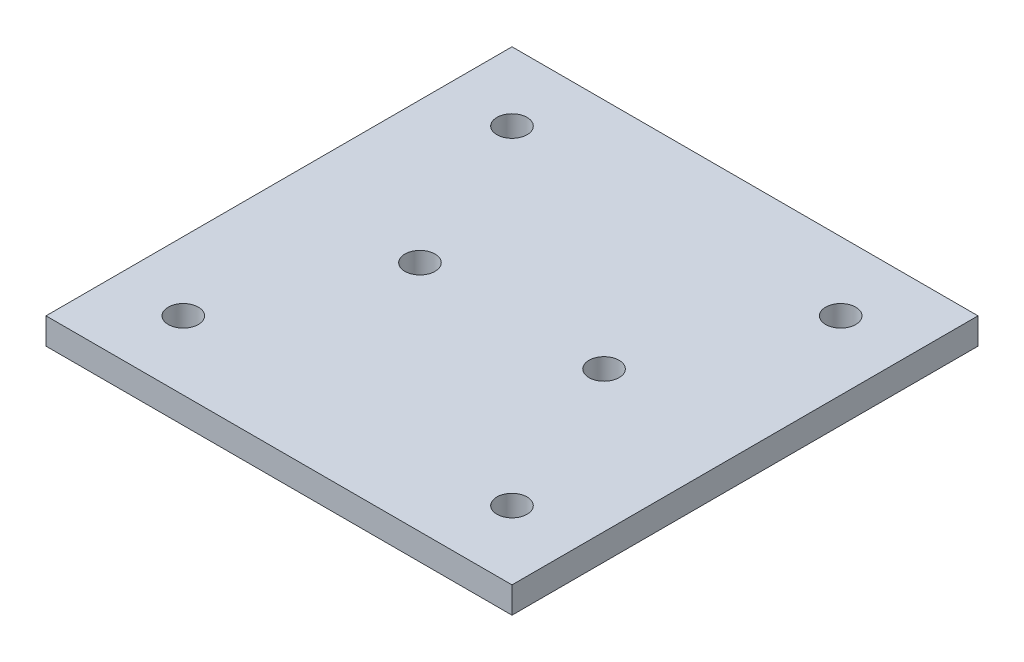
ISO-10303-21;
HEADER;
FILE_DESCRIPTION(('STEP AP214'),'2;1');
FILE_NAME('part.step','',(''),(''),'','','');
FILE_SCHEMA(('AUTOMOTIVE_DESIGN { 1 0 10303 214 1 1 1 1 }'));
ENDSEC;
DATA;
#1=APPLICATION_CONTEXT('core data for automotive mechanical design processes');
#2=APPLICATION_PROTOCOL_DEFINITION('international standard','automotive_design',2000,#1);
#3=PRODUCT_CONTEXT('',#1,'mechanical');
#4=PRODUCT('Part','Part','',(#3));
#5=PRODUCT_RELATED_PRODUCT_CATEGORY('part','',(#4));
#6=PRODUCT_DEFINITION_FORMATION('','',#4);
#7=PRODUCT_DEFINITION_CONTEXT('part definition',#1,'design');
#8=PRODUCT_DEFINITION('design','',#6,#7);
#9=PRODUCT_DEFINITION_SHAPE('','',#8);
#10=(LENGTH_UNIT() NAMED_UNIT(*) SI_UNIT(.MILLI.,.METRE.));
#11=(NAMED_UNIT(*) PLANE_ANGLE_UNIT() SI_UNIT($,.RADIAN.));
#12=(NAMED_UNIT(*) SI_UNIT($,.STERADIAN.) SOLID_ANGLE_UNIT());
#13=UNCERTAINTY_MEASURE_WITH_UNIT(LENGTH_MEASURE(1.E-05),#10,'distance_accuracy_value','');
#14=(GEOMETRIC_REPRESENTATION_CONTEXT(3) GLOBAL_UNCERTAINTY_ASSIGNED_CONTEXT((#13)) GLOBAL_UNIT_ASSIGNED_CONTEXT((#10,
#11,#12)) REPRESENTATION_CONTEXT('',''));
#15=CARTESIAN_POINT('',(0.,0.,0.));
#16=DIRECTION('',(0.,0.,1.));
#17=DIRECTION('',(1.,0.,0.));
#18=AXIS2_PLACEMENT_3D('',#15,#16,#17);
#19=CARTESIAN_POINT('',(0.,2.,0.));
#20=DIRECTION('',(0.,1.,0.));
#21=DIRECTION('',(0.,0.,1.));
#22=AXIS2_PLACEMENT_3D('',#19,#20,#21);
#23=PLANE('',#22);
#24=CARTESIAN_POINT('',(-7.,2.,0.));
#25=DIRECTION('',(0.,1.,0.));
#26=DIRECTION('',(0.,0.,1.));
#27=AXIS2_PLACEMENT_3D('',#24,#25,#26);
#28=CIRCLE('',#27,1.1462255868277);
#29=CARTESIAN_POINT('',(-7.,2.,1.1462255868277));
#30=VERTEX_POINT('',#29);
#31=EDGE_CURVE('E133',#30,#30,#28,.T.);
#32=ORIENTED_EDGE('',*,*,#31,.F.);
#33=EDGE_LOOP('',(#32));
#34=FACE_BOUND('',#33,.T.);
#35=CARTESIAN_POINT('',(12.5,2.,12.5));
#36=DIRECTION('',(0.,1.,0.));
#37=DIRECTION('',(0.,0.,1.));
#38=AXIS2_PLACEMENT_3D('',#35,#36,#37);
#39=CIRCLE('',#38,1.1462255868277);
#40=CARTESIAN_POINT('',(12.5,2.,13.6462255868277));
#41=VERTEX_POINT('',#40);
#42=EDGE_CURVE('E121',#41,#41,#39,.T.);
#43=ORIENTED_EDGE('',*,*,#42,.F.);
#44=EDGE_LOOP('',(#43));
#45=FACE_BOUND('',#44,.T.);
#46=CARTESIAN_POINT('',(-12.5,2.,-12.5));
#47=DIRECTION('',(0.,1.,0.));
#48=DIRECTION('',(0.,0.,1.));
#49=AXIS2_PLACEMENT_3D('',#46,#47,#48);
#50=CIRCLE('',#49,1.1462255868277);
#51=CARTESIAN_POINT('',(-12.5,2.,-11.3537744131723));
#52=VERTEX_POINT('',#51);
#53=EDGE_CURVE('E100',#52,#52,#50,.T.);
#54=ORIENTED_EDGE('',*,*,#53,.F.);
#55=EDGE_LOOP('',(#54));
#56=FACE_BOUND('',#55,.T.);
#57=DIRECTION('',(0.,0.,1.));
#58=VECTOR('',#57,1.);
#59=CARTESIAN_POINT('',(-17.7215425612055,2.,17.7215425612055));
#60=LINE('',#59,#58);
#61=CARTESIAN_POINT('',(-17.7215425612055,2.,-17.7215425612055));
#62=VERTEX_POINT('',#61);
#63=CARTESIAN_POINT('',(-17.7215425612055,2.,17.7215425612055));
#64=VERTEX_POINT('',#63);
#65=EDGE_CURVE('E85',#62,#64,#60,.T.);
#66=ORIENTED_EDGE('',*,*,#65,.T.);
#67=DIRECTION('',(1.,0.,0.));
#68=VECTOR('',#67,1.);
#69=CARTESIAN_POINT('',(17.7215425612055,2.,17.7215425612055));
#70=LINE('',#69,#68);
#71=CARTESIAN_POINT('',(17.7215425612055,2.,17.7215425612055));
#72=VERTEX_POINT('',#71);
#73=EDGE_CURVE('E80',#64,#72,#70,.T.);
#74=ORIENTED_EDGE('',*,*,#73,.T.);
#75=DIRECTION('',(0.,0.,-1.));
#76=VECTOR('',#75,1.);
#77=CARTESIAN_POINT('',(17.7215425612055,2.,17.7215425612055));
#78=LINE('',#77,#76);
#79=CARTESIAN_POINT('',(17.7215425612055,2.,-17.7215425612055));
#80=VERTEX_POINT('',#79);
#81=EDGE_CURVE('E83',#72,#80,#78,.T.);
#82=ORIENTED_EDGE('',*,*,#81,.T.);
#83=DIRECTION('',(-1.,0.,0.));
#84=VECTOR('',#83,1.);
#85=CARTESIAN_POINT('',(17.7215425612055,2.,-17.7215425612055));
#86=LINE('',#85,#84);
#87=EDGE_CURVE('E50',#80,#62,#86,.T.);
#88=ORIENTED_EDGE('',*,*,#87,.T.);
#89=EDGE_LOOP('',(#66,#74,#82,#88));
#90=FACE_BOUND('',#89,.T.);
#91=CARTESIAN_POINT('',(12.5,2.,-12.5));
#92=DIRECTION('',(0.,1.,0.));
#93=DIRECTION('',(0.,0.,-1.));
#94=AXIS2_PLACEMENT_3D('',#91,#92,#93);
#95=CIRCLE('',#94,1.1462255868277);
#96=CARTESIAN_POINT('',(12.5,2.,-13.6462255868277));
#97=VERTEX_POINT('',#96);
#98=EDGE_CURVE('E115',#97,#97,#95,.T.);
#99=ORIENTED_EDGE('',*,*,#98,.F.);
#100=EDGE_LOOP('',(#99));
#101=FACE_BOUND('',#100,.T.);
#102=CARTESIAN_POINT('',(-12.5,2.,12.5));
#103=DIRECTION('',(0.,1.,0.));
#104=DIRECTION('',(0.,0.,-1.));
#105=AXIS2_PLACEMENT_3D('',#102,#103,#104);
#106=CIRCLE('',#105,1.1462255868277);
#107=CARTESIAN_POINT('',(-12.5,2.,11.3537744131723));
#108=VERTEX_POINT('',#107);
#109=EDGE_CURVE('E127',#108,#108,#106,.T.);
#110=ORIENTED_EDGE('',*,*,#109,.F.);
#111=EDGE_LOOP('',(#110));
#112=FACE_BOUND('',#111,.T.);
#113=CARTESIAN_POINT('',(7.,2.,0.));
#114=DIRECTION('',(0.,1.,0.));
#115=DIRECTION('',(0.,0.,-1.));
#116=AXIS2_PLACEMENT_3D('',#113,#114,#115);
#117=CIRCLE('',#116,1.1462255868277);
#118=CARTESIAN_POINT('',(7.,2.,-1.14622558682769));
#119=VERTEX_POINT('',#118);
#120=EDGE_CURVE('E139',#119,#119,#117,.T.);
#121=ORIENTED_EDGE('',*,*,#120,.F.);
#122=EDGE_LOOP('',(#121));
#123=FACE_BOUND('',#122,.T.);
#124=ADVANCED_FACE('F33',(#34,#45,#56,#90,#101,#112,#123),#23,.T.);
#125=CARTESIAN_POINT('',(0.,0.,0.));
#126=DIRECTION('',(0.,1.,0.));
#127=DIRECTION('',(0.,0.,1.));
#128=AXIS2_PLACEMENT_3D('',#125,#126,#127);
#129=PLANE('',#128);
#130=CARTESIAN_POINT('',(-7.,0.,0.));
#131=DIRECTION('',(0.,1.,0.));
#132=DIRECTION('',(0.,0.,1.));
#133=AXIS2_PLACEMENT_3D('',#130,#131,#132);
#134=CIRCLE('',#133,1.1462255868277);
#135=CARTESIAN_POINT('',(-7.,0.,1.1462255868277));
#136=VERTEX_POINT('',#135);
#137=EDGE_CURVE('E136',#136,#136,#134,.T.);
#138=ORIENTED_EDGE('',*,*,#137,.T.);
#139=EDGE_LOOP('',(#138));
#140=FACE_BOUND('',#139,.T.);
#141=CARTESIAN_POINT('',(12.5,0.,12.5));
#142=DIRECTION('',(0.,1.,0.));
#143=DIRECTION('',(0.,0.,1.));
#144=AXIS2_PLACEMENT_3D('',#141,#142,#143);
#145=CIRCLE('',#144,1.1462255868277);
#146=CARTESIAN_POINT('',(12.5,0.,13.6462255868277));
#147=VERTEX_POINT('',#146);
#148=EDGE_CURVE('E124',#147,#147,#145,.T.);
#149=ORIENTED_EDGE('',*,*,#148,.T.);
#150=EDGE_LOOP('',(#149));
#151=FACE_BOUND('',#150,.T.);
#152=CARTESIAN_POINT('',(-12.5,0.,-12.5));
#153=DIRECTION('',(0.,1.,0.));
#154=DIRECTION('',(0.,0.,1.));
#155=AXIS2_PLACEMENT_3D('',#152,#153,#154);
#156=CIRCLE('',#155,1.1462255868277);
#157=CARTESIAN_POINT('',(-12.5,0.,-11.3537744131723));
#158=VERTEX_POINT('',#157);
#159=EDGE_CURVE('E112',#158,#158,#156,.T.);
#160=ORIENTED_EDGE('',*,*,#159,.T.);
#161=EDGE_LOOP('',(#160));
#162=FACE_BOUND('',#161,.T.);
#163=DIRECTION('',(0.,0.,1.));
#164=VECTOR('',#163,1.);
#165=CARTESIAN_POINT('',(-17.7215425612055,0.,17.7215425612055));
#166=LINE('',#165,#164);
#167=CARTESIAN_POINT('',(-17.7215425612055,0.,-17.7215425612055));
#168=VERTEX_POINT('',#167);
#169=CARTESIAN_POINT('',(-17.7215425612055,0.,17.7215425612055));
#170=VERTEX_POINT('',#169);
#171=EDGE_CURVE('E97',#168,#170,#166,.T.);
#172=ORIENTED_EDGE('',*,*,#171,.F.);
#173=DIRECTION('',(-1.,0.,0.));
#174=VECTOR('',#173,1.);
#175=CARTESIAN_POINT('',(17.7215425612055,0.,-17.7215425612055));
#176=LINE('',#175,#174);
#177=CARTESIAN_POINT('',(17.7215425612055,0.,-17.7215425612055));
#178=VERTEX_POINT('',#177);
#179=EDGE_CURVE('E73',#178,#168,#176,.T.);
#180=ORIENTED_EDGE('',*,*,#179,.F.);
#181=DIRECTION('',(0.,0.,-1.));
#182=VECTOR('',#181,1.);
#183=CARTESIAN_POINT('',(17.7215425612055,0.,17.7215425612055));
#184=LINE('',#183,#182);
#185=CARTESIAN_POINT('',(17.7215425612055,0.,17.7215425612055));
#186=VERTEX_POINT('',#185);
#187=EDGE_CURVE('E67',#186,#178,#184,.T.);
#188=ORIENTED_EDGE('',*,*,#187,.F.);
#189=DIRECTION('',(1.,0.,0.));
#190=VECTOR('',#189,1.);
#191=CARTESIAN_POINT('',(17.7215425612055,0.,17.7215425612055));
#192=LINE('',#191,#190);
#193=EDGE_CURVE('E89',#170,#186,#192,.T.);
#194=ORIENTED_EDGE('',*,*,#193,.F.);
#195=EDGE_LOOP('',(#172,#180,#188,#194));
#196=FACE_BOUND('',#195,.T.);
#197=CARTESIAN_POINT('',(12.5,0.,-12.5));
#198=DIRECTION('',(0.,1.,0.));
#199=DIRECTION('',(0.,0.,-1.));
#200=AXIS2_PLACEMENT_3D('',#197,#198,#199);
#201=CIRCLE('',#200,1.1462255868277);
#202=CARTESIAN_POINT('',(12.5,0.,-13.6462255868277));
#203=VERTEX_POINT('',#202);
#204=EDGE_CURVE('E118',#203,#203,#201,.T.);
#205=ORIENTED_EDGE('',*,*,#204,.T.);
#206=EDGE_LOOP('',(#205));
#207=FACE_BOUND('',#206,.T.);
#208=CARTESIAN_POINT('',(-12.5,0.,12.5));
#209=DIRECTION('',(0.,1.,0.));
#210=DIRECTION('',(0.,0.,-1.));
#211=AXIS2_PLACEMENT_3D('',#208,#209,#210);
#212=CIRCLE('',#211,1.1462255868277);
#213=CARTESIAN_POINT('',(-12.5,0.,11.3537744131723));
#214=VERTEX_POINT('',#213);
#215=EDGE_CURVE('E130',#214,#214,#212,.T.);
#216=ORIENTED_EDGE('',*,*,#215,.T.);
#217=EDGE_LOOP('',(#216));
#218=FACE_BOUND('',#217,.T.);
#219=CARTESIAN_POINT('',(7.,0.,0.));
#220=DIRECTION('',(0.,1.,0.));
#221=DIRECTION('',(0.,0.,-1.));
#222=AXIS2_PLACEMENT_3D('',#219,#220,#221);
#223=CIRCLE('',#222,1.1462255868277);
#224=CARTESIAN_POINT('',(7.,0.,-1.14622558682769));
#225=VERTEX_POINT('',#224);
#226=EDGE_CURVE('E142',#225,#225,#223,.T.);
#227=ORIENTED_EDGE('',*,*,#226,.T.);
#228=EDGE_LOOP('',(#227));
#229=FACE_BOUND('',#228,.T.);
#230=ADVANCED_FACE('F108',(#140,#151,#162,#196,#207,#218,#229),#129,.F.);
#231=CARTESIAN_POINT('',(-17.7215425612055,2.,17.7215425612055));
#232=DIRECTION('',(1.,0.,0.));
#233=DIRECTION('',(0.,0.,-1.));
#234=AXIS2_PLACEMENT_3D('',#231,#232,#233);
#235=PLANE('',#234);
#236=ORIENTED_EDGE('',*,*,#171,.T.);
#237=DIRECTION('',(0.,-1.,0.));
#238=VECTOR('',#237,1.);
#239=CARTESIAN_POINT('',(-17.7215425612055,2.,17.7215425612055));
#240=LINE('',#239,#238);
#241=EDGE_CURVE('E11',#64,#170,#240,.T.);
#242=ORIENTED_EDGE('',*,*,#241,.F.);
#243=ORIENTED_EDGE('',*,*,#65,.F.);
#244=DIRECTION('',(0.,-1.,0.));
#245=VECTOR('',#244,1.);
#246=CARTESIAN_POINT('',(-17.7215425612055,2.,-17.7215425612055));
#247=LINE('',#246,#245);
#248=EDGE_CURVE('E93',#62,#168,#247,.T.);
#249=ORIENTED_EDGE('',*,*,#248,.T.);
#250=EDGE_LOOP('',(#236,#242,#243,#249));
#251=FACE_BOUND('',#250,.T.);
#252=ADVANCED_FACE('F35',(#251),#235,.F.);
#253=CARTESIAN_POINT('',(17.7215425612055,2.,17.7215425612055));
#254=DIRECTION('',(0.,0.,-1.));
#255=DIRECTION('',(-1.,0.,0.));
#256=AXIS2_PLACEMENT_3D('',#253,#254,#255);
#257=PLANE('',#256);
#258=ORIENTED_EDGE('',*,*,#193,.T.);
#259=DIRECTION('',(0.,-1.,0.));
#260=VECTOR('',#259,1.);
#261=CARTESIAN_POINT('',(17.7215425612055,2.,17.7215425612055));
#262=LINE('',#261,#260);
#263=EDGE_CURVE('E42',#72,#186,#262,.T.);
#264=ORIENTED_EDGE('',*,*,#263,.F.);
#265=ORIENTED_EDGE('',*,*,#73,.F.);
#266=ORIENTED_EDGE('',*,*,#241,.T.);
#267=EDGE_LOOP('',(#258,#264,#265,#266));
#268=FACE_BOUND('',#267,.T.);
#269=ADVANCED_FACE('F88',(#268),#257,.F.);
#270=CARTESIAN_POINT('',(17.7215425612055,2.,17.7215425612055));
#271=DIRECTION('',(-1.,0.,0.));
#272=DIRECTION('',(0.,0.,1.));
#273=AXIS2_PLACEMENT_3D('',#270,#271,#272);
#274=PLANE('',#273);
#275=ORIENTED_EDGE('',*,*,#187,.T.);
#276=DIRECTION('',(0.,-1.,0.));
#277=VECTOR('',#276,1.);
#278=CARTESIAN_POINT('',(17.7215425612055,2.,-17.7215425612055));
#279=LINE('',#278,#277);
#280=EDGE_CURVE('E90',#80,#178,#279,.T.);
#281=ORIENTED_EDGE('',*,*,#280,.F.);
#282=ORIENTED_EDGE('',*,*,#81,.F.);
#283=ORIENTED_EDGE('',*,*,#263,.T.);
#284=EDGE_LOOP('',(#275,#281,#282,#283));
#285=FACE_BOUND('',#284,.T.);
#286=ADVANCED_FACE('F91',(#285),#274,.F.);
#287=CARTESIAN_POINT('',(17.7215425612055,2.,-17.7215425612055));
#288=DIRECTION('',(0.,0.,1.));
#289=DIRECTION('',(1.,0.,0.));
#290=AXIS2_PLACEMENT_3D('',#287,#288,#289);
#291=PLANE('',#290);
#292=ORIENTED_EDGE('',*,*,#179,.T.);
#293=ORIENTED_EDGE('',*,*,#248,.F.);
#294=ORIENTED_EDGE('',*,*,#87,.F.);
#295=ORIENTED_EDGE('',*,*,#280,.T.);
#296=EDGE_LOOP('',(#292,#293,#294,#295));
#297=FACE_BOUND('',#296,.T.);
#298=ADVANCED_FACE('F105',(#297),#291,.F.);
#299=CARTESIAN_POINT('',(-12.5,2.,-12.5));
#300=DIRECTION('',(0.,-1.,0.));
#301=DIRECTION('',(0.,0.,-1.));
#302=AXIS2_PLACEMENT_3D('',#299,#300,#301);
#303=CYLINDRICAL_SURFACE('',#302,1.1462255868277);
#304=ORIENTED_EDGE('',*,*,#53,.T.);
#305=EDGE_LOOP('',(#304));
#306=FACE_BOUND('',#305,.T.);
#307=ORIENTED_EDGE('',*,*,#159,.F.);
#308=EDGE_LOOP('',(#307));
#309=FACE_BOUND('',#308,.T.);
#310=ADVANCED_FACE('F162',(#306,#309),#303,.F.);
#311=CARTESIAN_POINT('',(12.5,2.,-12.5));
#312=DIRECTION('',(0.,-1.,0.));
#313=DIRECTION('',(0.,0.,-1.));
#314=AXIS2_PLACEMENT_3D('',#311,#312,#313);
#315=CYLINDRICAL_SURFACE('',#314,1.1462255868277);
#316=ORIENTED_EDGE('',*,*,#98,.T.);
#317=EDGE_LOOP('',(#316));
#318=FACE_BOUND('',#317,.T.);
#319=ORIENTED_EDGE('',*,*,#204,.F.);
#320=EDGE_LOOP('',(#319));
#321=FACE_BOUND('',#320,.T.);
#322=ADVANCED_FACE('F208',(#318,#321),#315,.F.);
#323=CARTESIAN_POINT('',(12.5,2.,12.5));
#324=DIRECTION('',(0.,-1.,0.));
#325=DIRECTION('',(0.,0.,-1.));
#326=AXIS2_PLACEMENT_3D('',#323,#324,#325);
#327=CYLINDRICAL_SURFACE('',#326,1.1462255868277);
#328=ORIENTED_EDGE('',*,*,#42,.T.);
#329=EDGE_LOOP('',(#328));
#330=FACE_BOUND('',#329,.T.);
#331=ORIENTED_EDGE('',*,*,#148,.F.);
#332=EDGE_LOOP('',(#331));
#333=FACE_BOUND('',#332,.T.);
#334=ADVANCED_FACE('F216',(#330,#333),#327,.F.);
#335=CARTESIAN_POINT('',(-12.5,2.,12.5));
#336=DIRECTION('',(0.,-1.,0.));
#337=DIRECTION('',(0.,0.,-1.));
#338=AXIS2_PLACEMENT_3D('',#335,#336,#337);
#339=CYLINDRICAL_SURFACE('',#338,1.1462255868277);
#340=ORIENTED_EDGE('',*,*,#109,.T.);
#341=EDGE_LOOP('',(#340));
#342=FACE_BOUND('',#341,.T.);
#343=ORIENTED_EDGE('',*,*,#215,.F.);
#344=EDGE_LOOP('',(#343));
#345=FACE_BOUND('',#344,.T.);
#346=ADVANCED_FACE('F224',(#342,#345),#339,.F.);
#347=CARTESIAN_POINT('',(-7.,2.,0.));
#348=DIRECTION('',(0.,-1.,0.));
#349=DIRECTION('',(0.,0.,-1.));
#350=AXIS2_PLACEMENT_3D('',#347,#348,#349);
#351=CYLINDRICAL_SURFACE('',#350,1.1462255868277);
#352=ORIENTED_EDGE('',*,*,#31,.T.);
#353=EDGE_LOOP('',(#352));
#354=FACE_BOUND('',#353,.T.);
#355=ORIENTED_EDGE('',*,*,#137,.F.);
#356=EDGE_LOOP('',(#355));
#357=FACE_BOUND('',#356,.T.);
#358=ADVANCED_FACE('F233',(#354,#357),#351,.F.);
#359=CARTESIAN_POINT('',(7.,2.,0.));
#360=DIRECTION('',(0.,-1.,0.));
#361=DIRECTION('',(0.,0.,-1.));
#362=AXIS2_PLACEMENT_3D('',#359,#360,#361);
#363=CYLINDRICAL_SURFACE('',#362,1.1462255868277);
#364=ORIENTED_EDGE('',*,*,#120,.T.);
#365=EDGE_LOOP('',(#364));
#366=FACE_BOUND('',#365,.T.);
#367=ORIENTED_EDGE('',*,*,#226,.F.);
#368=EDGE_LOOP('',(#367));
#369=FACE_BOUND('',#368,.T.);
#370=ADVANCED_FACE('F148',(#366,#369),#363,.F.);
#371=CLOSED_SHELL('',(#124,#230,#252,#269,#286,#298,#310,#322,#334,#346,#358,#370));
#372=MANIFOLD_SOLID_BREP('B2',#371);
#373=ADVANCED_BREP_SHAPE_REPRESENTATION('',(#18,#372),#14);
#374=SHAPE_DEFINITION_REPRESENTATION(#9,#373);
ENDSEC;
END-ISO-10303-21;
